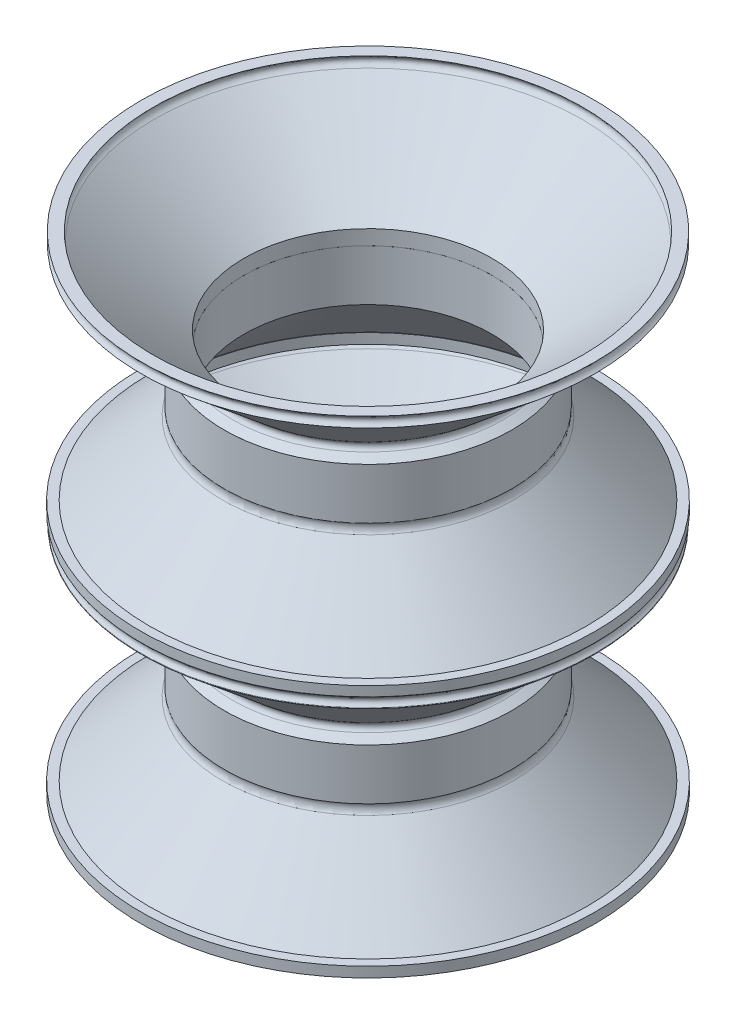
ISO-10303-21;
HEADER;
FILE_DESCRIPTION(('STEP AP214'),'2;1');
FILE_NAME('part.step','',(''),(''),'','','');
FILE_SCHEMA(('AUTOMOTIVE_DESIGN { 1 0 10303 214 1 1 1 1 }'));
ENDSEC;
DATA;
#1=APPLICATION_CONTEXT('core data for automotive mechanical design processes');
#2=APPLICATION_PROTOCOL_DEFINITION('international standard','automotive_design',2000,#1);
#3=PRODUCT_CONTEXT('',#1,'mechanical');
#4=PRODUCT('Part','Part','',(#3));
#5=PRODUCT_RELATED_PRODUCT_CATEGORY('part','',(#4));
#6=PRODUCT_DEFINITION_FORMATION('','',#4);
#7=PRODUCT_DEFINITION_CONTEXT('part definition',#1,'design');
#8=PRODUCT_DEFINITION('design','',#6,#7);
#9=PRODUCT_DEFINITION_SHAPE('','',#8);
#10=(LENGTH_UNIT() NAMED_UNIT(*) SI_UNIT(.MILLI.,.METRE.));
#11=(NAMED_UNIT(*) PLANE_ANGLE_UNIT() SI_UNIT($,.RADIAN.));
#12=(NAMED_UNIT(*) SI_UNIT($,.STERADIAN.) SOLID_ANGLE_UNIT());
#13=UNCERTAINTY_MEASURE_WITH_UNIT(LENGTH_MEASURE(1.E-05),#10,'distance_accuracy_value','');
#14=(GEOMETRIC_REPRESENTATION_CONTEXT(3) GLOBAL_UNCERTAINTY_ASSIGNED_CONTEXT((#13)) GLOBAL_UNIT_ASSIGNED_CONTEXT((#10,
#11,#12)) REPRESENTATION_CONTEXT('',''));
#15=CARTESIAN_POINT('',(0.,0.,0.));
#16=DIRECTION('',(0.,0.,1.));
#17=DIRECTION('',(1.,0.,0.));
#18=AXIS2_PLACEMENT_3D('',#15,#16,#17);
#19=CARTESIAN_POINT('',(12.266246150267,23.84,0.));
#20=DIRECTION('',(0.,-1.,0.));
#21=DIRECTION('',(1.,0.,0.));
#22=AXIS2_PLACEMENT_3D('',#19,#20,#21);
#23=CONICAL_SURFACE('',#22,12.7105503207346,1.02390555454664);
#24=CARTESIAN_POINT('',(12.266246150267,23.4777114557299,0.));
#25=DIRECTION('',(0.,-1.,0.));
#26=DIRECTION('',(1.,0.,0.));
#27=AXIS2_PLACEMENT_3D('',#24,#25,#26);
#28=CIRCLE('',#27,13.3056020683309);
#29=CARTESIAN_POINT('',(25.5718482185979,23.4777114557299,0.));
#30=VERTEX_POINT('',#29);
#31=EDGE_CURVE('E11',#30,#30,#28,.T.);
#32=ORIENTED_EDGE('',*,*,#31,.T.);
#33=EDGE_LOOP('',(#32));
#34=FACE_BOUND('',#33,.T.);
#35=CARTESIAN_POINT('',(12.266246150267,22.9918152658715,0.));
#36=DIRECTION('',(0.,1.,0.));
#37=DIRECTION('',(-1.,0.,0.));
#38=AXIS2_PLACEMENT_3D('',#35,#36,#37);
#39=CIRCLE('',#38,14.1036769219207);
#40=CARTESIAN_POINT('',(-1.83743077165368,22.9918152658715,0.));
#41=VERTEX_POINT('',#40);
#42=EDGE_CURVE('E77',#41,#41,#39,.T.);
#43=ORIENTED_EDGE('',*,*,#42,.T.);
#44=EDGE_LOOP('',(#43));
#45=FACE_BOUND('',#44,.T.);
#46=ADVANCED_FACE('F54',(#34,#45),#23,.T.);
#47=CARTESIAN_POINT('',(12.266246150267,31.84,0.));
#48=DIRECTION('',(0.,1.,0.));
#49=DIRECTION('',(-1.,0.,0.));
#50=AXIS2_PLACEMENT_3D('',#47,#48,#49);
#51=CONICAL_SURFACE('',#50,22.2445790614883,0.87266462599717);
#52=CARTESIAN_POINT('',(12.266246150267,24.2878064534284,0.));
#53=DIRECTION('',(0.,1.,0.));
#54=DIRECTION('',(-1.,0.,0.));
#55=AXIS2_PLACEMENT_3D('',#52,#53,#54);
#56=CIRCLE('',#55,13.2442252703947);
#57=CARTESIAN_POINT('',(-0.977979120127719,24.2878064534284,0.));
#58=VERTEX_POINT('',#57);
#59=EDGE_CURVE('E61',#58,#58,#56,.T.);
#60=ORIENTED_EDGE('',*,*,#59,.T.);
#61=EDGE_LOOP('',(#60));
#62=FACE_BOUND('',#61,.T.);
#63=CARTESIAN_POINT('',(12.266246150267,31.84,0.));
#64=DIRECTION('',(0.,1.,0.));
#65=DIRECTION('',(-1.,0.,0.));
#66=AXIS2_PLACEMENT_3D('',#63,#64,#65);
#67=CIRCLE('',#66,22.2445790614883);
#68=CARTESIAN_POINT('',(-9.97833291122136,31.84,0.));
#69=VERTEX_POINT('',#68);
#70=EDGE_CURVE('E65',#69,#69,#67,.T.);
#71=ORIENTED_EDGE('',*,*,#70,.F.);
#72=EDGE_LOOP('',(#71));
#73=FACE_BOUND('',#72,.T.);
#74=ADVANCED_FACE('F123',(#62,#73),#51,.T.);
#75=CARTESIAN_POINT('',(12.266246150267,24.4397502558786,0.));
#76=DIRECTION('',(0.,1.,0.));
#77=DIRECTION('',(-1.,0.,0.));
#78=AXIS2_PLACEMENT_3D('',#75,#76,#77);
#79=CONICAL_SURFACE('',#78,12.1807257813488,0.87266462599717);
#80=CARTESIAN_POINT('',(12.266246150267,31.84,0.));
#81=DIRECTION('',(0.,-1.,0.));
#82=DIRECTION('',(1.,0.,0.));
#83=AXIS2_PLACEMENT_3D('',#80,#81,#82);
#84=CIRCLE('',#83,21.);
#85=CARTESIAN_POINT('',(33.266246150267,31.84,0.));
#86=VERTEX_POINT('',#85);
#87=EDGE_CURVE('E86',#86,#86,#84,.T.);
#88=ORIENTED_EDGE('',*,*,#87,.F.);
#89=EDGE_LOOP('',(#88));
#90=FACE_BOUND('',#89,.T.);
#91=CARTESIAN_POINT('',(12.266246150267,24.4397502558786,0.));
#92=DIRECTION('',(0.,1.,0.));
#93=DIRECTION('',(-1.,0.,0.));
#94=AXIS2_PLACEMENT_3D('',#91,#92,#93);
#95=CIRCLE('',#94,12.1807257813488);
#96=CARTESIAN_POINT('',(0.0855203689181672,24.4397502558786,0.));
#97=VERTEX_POINT('',#96);
#98=EDGE_CURVE('E69',#97,#97,#95,.T.);
#99=ORIENTED_EDGE('',*,*,#98,.F.);
#100=EDGE_LOOP('',(#99));
#101=FACE_BOUND('',#100,.T.);
#102=ADVANCED_FACE('F119',(#90,#101),#79,.F.);
#103=CARTESIAN_POINT('',(12.266246150267,31.4490180328199,0.));
#104=DIRECTION('',(0.,1.,0.));
#105=DIRECTION('',(-1.,0.,0.));
#106=AXIS2_PLACEMENT_3D('',#103,#104,#105);
#107=CYLINDRICAL_SURFACE('',#106,12.1807257813488);
#108=ORIENTED_EDGE('',*,*,#98,.T.);
#109=EDGE_LOOP('',(#108));
#110=FACE_BOUND('',#109,.T.);
#111=CARTESIAN_POINT('',(12.266246150267,22.9918152658715,0.));
#112=DIRECTION('',(0.,1.,0.));
#113=DIRECTION('',(-1.,0.,0.));
#114=AXIS2_PLACEMENT_3D('',#111,#112,#113);
#115=CIRCLE('',#114,12.1807257813488);
#116=CARTESIAN_POINT('',(0.0855203689181672,22.9918152658715,0.));
#117=VERTEX_POINT('',#116);
#118=EDGE_CURVE('E74',#117,#117,#115,.T.);
#119=ORIENTED_EDGE('',*,*,#118,.F.);
#120=EDGE_LOOP('',(#119));
#121=FACE_BOUND('',#120,.T.);
#122=ADVANCED_FACE('F115',(#110,#121),#107,.F.);
#123=CARTESIAN_POINT('',(0.0855203689181681,22.9918152658715,0.));
#124=DIRECTION('',(0.,-1.,0.));
#125=DIRECTION('',(1.,0.,0.));
#126=AXIS2_PLACEMENT_3D('',#123,#124,#125);
#127=PLANE('',#126);
#128=ORIENTED_EDGE('',*,*,#118,.T.);
#129=EDGE_LOOP('',(#128));
#130=FACE_BOUND('',#129,.T.);
#131=ORIENTED_EDGE('',*,*,#42,.F.);
#132=EDGE_LOOP('',(#131));
#133=FACE_BOUND('',#132,.T.);
#134=ADVANCED_FACE('F112',(#130,#133),#127,.T.);
#135=CARTESIAN_POINT('',(12.266246150267,23.9047842318689,0.));
#136=DIRECTION('',(0.,1.,0.));
#137=DIRECTION('',(-1.,0.,0.));
#138=AXIS2_PLACEMENT_3D('',#135,#136,#137);
#139=TOROIDAL_SURFACE('',#138,13.565619075238,0.5);
#140=ORIENTED_EDGE('',*,*,#31,.F.);
#141=EDGE_LOOP('',(#140));
#142=FACE_BOUND('',#141,.T.);
#143=ORIENTED_EDGE('',*,*,#59,.F.);
#144=EDGE_LOOP('',(#143));
#145=FACE_BOUND('',#144,.T.);
#146=ADVANCED_FACE('F56',(#142,#145),#139,.F.);
#147=CARTESIAN_POINT('',(-8.73375384973302,31.84,0.));
#148=CARTESIAN_POINT('',(-9.41713424360817,32.2947580248928,0.));
#149=CARTESIAN_POINT('',(-8.79657882871846,32.84,0.));
#150=B_SPLINE_CURVE_WITH_KNOTS('',2,(#147,#148,#149),.UNSPECIFIED.,.F.,.F.,(3,3),(0.,1.),.UNSPECIFIED.);
#151=CARTESIAN_POINT('',(12.266246150267,3.87015566974782,0.));
#152=DIRECTION('',(0.,-1.,0.));
#153=AXIS1_PLACEMENT('',#151,#152);
#154=SURFACE_OF_REVOLUTION('',#150,#153);
#155=CARTESIAN_POINT('',(12.266246150267,32.84,0.));
#156=DIRECTION('',(0.,-1.,0.));
#157=DIRECTION('',(1.,0.,0.));
#158=AXIS2_PLACEMENT_3D('',#155,#156,#157);
#159=CIRCLE('',#158,21.0628249789854);
#160=CARTESIAN_POINT('',(33.3290711292524,32.84,0.));
#161=VERTEX_POINT('',#160);
#162=EDGE_CURVE('E80',#161,#161,#159,.T.);
#163=ORIENTED_EDGE('',*,*,#162,.F.);
#164=EDGE_LOOP('',(#163));
#165=FACE_BOUND('',#164,.T.);
#166=ORIENTED_EDGE('',*,*,#87,.T.);
#167=EDGE_LOOP('',(#166));
#168=FACE_BOUND('',#167,.T.);
#169=ADVANCED_FACE('F107',(#165,#168),#154,.T.);
#170=CARTESIAN_POINT('',(-8.79657882871846,32.84,0.));
#171=DIRECTION('',(0.,-1.,0.));
#172=DIRECTION('',(1.,0.,0.));
#173=AXIS2_PLACEMENT_3D('',#170,#171,#172);
#174=PLANE('',#173);
#175=CARTESIAN_POINT('',(12.266246150267,32.84,0.));
#176=DIRECTION('',(0.,-1.,0.));
#177=DIRECTION('',(1.,0.,0.));
#178=AXIS2_PLACEMENT_3D('',#175,#176,#177);
#179=CIRCLE('',#178,22.2445790614883);
#180=CARTESIAN_POINT('',(34.5108252117553,32.84,0.));
#181=VERTEX_POINT('',#180);
#182=EDGE_CURVE('E83',#181,#181,#179,.T.);
#183=ORIENTED_EDGE('',*,*,#182,.F.);
#184=EDGE_LOOP('',(#183));
#185=FACE_BOUND('',#184,.T.);
#186=ORIENTED_EDGE('',*,*,#162,.T.);
#187=EDGE_LOOP('',(#186));
#188=FACE_BOUND('',#187,.T.);
#189=ADVANCED_FACE('F103',(#185,#188),#174,.F.);
#190=CARTESIAN_POINT('',(-9.97833291122136,32.84,0.));
#191=CARTESIAN_POINT('',(-9.32229251414753,32.3233569168223,0.));
#192=CARTESIAN_POINT('',(-9.97833291122136,31.84,0.));
#193=B_SPLINE_CURVE_WITH_KNOTS('',2,(#190,#191,#192),.UNSPECIFIED.,.F.,.F.,(3,3),(0.,1.),.UNSPECIFIED.);
#194=CARTESIAN_POINT('',(12.266246150267,3.87015566974782,0.));
#195=DIRECTION('',(0.,-1.,0.));
#196=AXIS1_PLACEMENT('',#194,#195);
#197=SURFACE_OF_REVOLUTION('',#193,#196);
#198=ORIENTED_EDGE('',*,*,#70,.T.);
#199=EDGE_LOOP('',(#198));
#200=FACE_BOUND('',#199,.T.);
#201=ORIENTED_EDGE('',*,*,#182,.T.);
#202=EDGE_LOOP('',(#201));
#203=FACE_BOUND('',#202,.T.);
#204=ADVANCED_FACE('F100',(#200,#203),#197,.T.);
#205=CLOSED_SHELL('',(#46,#74,#102,#122,#134,#146,#169,#189,#204));
#206=MANIFOLD_SOLID_BREP('B2',#205);
#207=CARTESIAN_POINT('',(12.266246150267,22.9918152658715,0.));
#208=DIRECTION('',(0.,-1.,0.));
#209=DIRECTION('',(1.,0.,0.));
#210=AXIS2_PLACEMENT_3D('',#207,#208,#209);
#211=PLANE('',#210);
#212=CARTESIAN_POINT('',(12.266246150267,22.9918152658715,0.));
#213=DIRECTION('',(0.,-1.,0.));
#214=DIRECTION('',(1.,0.,0.));
#215=AXIS2_PLACEMENT_3D('',#212,#213,#214);
#216=CIRCLE('',#215,14.1036769219207);
#217=CARTESIAN_POINT('',(26.3699230721876,22.9918152658715,0.));
#218=VERTEX_POINT('',#217);
#219=EDGE_CURVE('E231',#218,#218,#216,.T.);
#220=ORIENTED_EDGE('',*,*,#219,.F.);
#221=EDGE_LOOP('',(#220));
#222=FACE_BOUND('',#221,.T.);
#223=CARTESIAN_POINT('',(12.266246150267,22.9918152658715,0.));
#224=DIRECTION('',(0.,-1.,0.));
#225=DIRECTION('',(1.,0.,0.));
#226=AXIS2_PLACEMENT_3D('',#223,#224,#225);
#227=CIRCLE('',#226,12.1807257813488);
#228=CARTESIAN_POINT('',(24.4469719316158,22.9918152658715,0.));
#229=VERTEX_POINT('',#228);
#230=EDGE_CURVE('E234',#229,#229,#227,.T.);
#231=ORIENTED_EDGE('',*,*,#230,.T.);
#232=EDGE_LOOP('',(#231));
#233=FACE_BOUND('',#232,.T.);
#234=ADVANCED_FACE('F213',(#222,#233),#211,.F.);
#235=CARTESIAN_POINT('',(12.266246150267,17.9918152658715,0.));
#236=DIRECTION('',(0.,1.,0.));
#237=DIRECTION('',(-1.,0.,0.));
#238=AXIS2_PLACEMENT_3D('',#235,#236,#237);
#239=CYLINDRICAL_SURFACE('',#238,14.1036769219207);
#240=CARTESIAN_POINT('',(12.266246150267,17.9918152658715,0.));
#241=DIRECTION('',(0.,-1.,0.));
#242=DIRECTION('',(1.,0.,0.));
#243=AXIS2_PLACEMENT_3D('',#240,#241,#242);
#244=CIRCLE('',#243,14.1036769219207);
#245=CARTESIAN_POINT('',(26.3699230721876,17.9918152658715,0.));
#246=VERTEX_POINT('',#245);
#247=EDGE_CURVE('E228',#246,#246,#244,.T.);
#248=ORIENTED_EDGE('',*,*,#247,.F.);
#249=EDGE_LOOP('',(#248));
#250=FACE_BOUND('',#249,.T.);
#251=ORIENTED_EDGE('',*,*,#219,.T.);
#252=EDGE_LOOP('',(#251));
#253=FACE_BOUND('',#252,.T.);
#254=ADVANCED_FACE('F279',(#250,#253),#239,.T.);
#255=CARTESIAN_POINT('',(12.266246150267,17.9918152658715,0.));
#256=DIRECTION('',(0.,1.,0.));
#257=DIRECTION('',(-1.,0.,0.));
#258=AXIS2_PLACEMENT_3D('',#255,#256,#257);
#259=CYLINDRICAL_SURFACE('',#258,12.1807257813488);
#260=CARTESIAN_POINT('',(12.266246150267,17.9918152658715,0.));
#261=DIRECTION('',(0.,-1.,0.));
#262=DIRECTION('',(1.,0.,0.));
#263=AXIS2_PLACEMENT_3D('',#260,#261,#262);
#264=CIRCLE('',#263,12.1807257813488);
#265=CARTESIAN_POINT('',(24.4469719316158,17.9918152658715,0.));
#266=VERTEX_POINT('',#265);
#267=EDGE_CURVE('E242',#266,#266,#264,.T.);
#268=ORIENTED_EDGE('',*,*,#267,.T.);
#269=EDGE_LOOP('',(#268));
#270=FACE_BOUND('',#269,.T.);
#271=ORIENTED_EDGE('',*,*,#230,.F.);
#272=EDGE_LOOP('',(#271));
#273=FACE_BOUND('',#272,.T.);
#274=ADVANCED_FACE('F285',(#270,#273),#259,.F.);
#275=CARTESIAN_POINT('',(12.266246150267,17.9918152658715,0.));
#276=DIRECTION('',(0.,-1.,0.));
#277=DIRECTION('',(1.,0.,0.));
#278=AXIS2_PLACEMENT_3D('',#275,#276,#277);
#279=CONICAL_SURFACE('',#278,13.4252337162371,0.785398163397447);
#280=CARTESIAN_POINT('',(12.266246150267,17.1342172194325,0.));
#281=DIRECTION('',(0.,1.,0.));
#282=DIRECTION('',(-1.,0.,0.));
#283=AXIS2_PLACEMENT_3D('',#280,#281,#282);
#284=CIRCLE('',#283,14.2828317626761);
#285=CARTESIAN_POINT('',(-2.01658561240912,17.1342172194325,0.));
#286=VERTEX_POINT('',#285);
#287=EDGE_CURVE('E224',#286,#286,#284,.F.);
#288=ORIENTED_EDGE('',*,*,#287,.T.);
#289=EDGE_LOOP('',(#288));
#290=FACE_BOUND('',#289,.T.);
#291=CARTESIAN_POINT('',(12.266246150267,9.99181526587148,0.));
#292=DIRECTION('',(0.,-1.,0.));
#293=DIRECTION('',(1.,0.,0.));
#294=AXIS2_PLACEMENT_3D('',#291,#292,#293);
#295=CIRCLE('',#294,21.4252337162371);
#296=CARTESIAN_POINT('',(33.6914798665041,9.99181526587149,0.));
#297=VERTEX_POINT('',#296);
#298=EDGE_CURVE('E239',#297,#297,#295,.T.);
#299=ORIENTED_EDGE('',*,*,#298,.F.);
#300=EDGE_LOOP('',(#299));
#301=FACE_BOUND('',#300,.T.);
#302=ADVANCED_FACE('F298',(#290,#301),#279,.T.);
#303=CARTESIAN_POINT('',(12.266246150267,9.99181526587148,0.));
#304=DIRECTION('',(0.,-1.,0.));
#305=DIRECTION('',(1.,0.,0.));
#306=AXIS2_PLACEMENT_3D('',#303,#304,#305);
#307=CONICAL_SURFACE('',#306,20.1807257813488,0.785398163397447);
#308=ORIENTED_EDGE('',*,*,#267,.F.);
#309=EDGE_LOOP('',(#308));
#310=FACE_BOUND('',#309,.T.);
#311=CARTESIAN_POINT('',(12.266246150267,9.99181526587148,0.));
#312=DIRECTION('',(0.,-1.,0.));
#313=DIRECTION('',(1.,0.,0.));
#314=AXIS2_PLACEMENT_3D('',#311,#312,#313);
#315=CIRCLE('',#314,20.1807257813488);
#316=CARTESIAN_POINT('',(32.4469719316158,9.99181526587148,0.));
#317=VERTEX_POINT('',#316);
#318=EDGE_CURVE('E243',#317,#317,#315,.T.);
#319=ORIENTED_EDGE('',*,*,#318,.T.);
#320=EDGE_LOOP('',(#319));
#321=FACE_BOUND('',#320,.T.);
#322=ADVANCED_FACE('F293',(#310,#321),#307,.F.);
#323=CARTESIAN_POINT('',(12.266246150267,17.6999026443817,0.));
#324=DIRECTION('',(0.,1.,0.));
#325=DIRECTION('',(-1.,0.,0.));
#326=AXIS2_PLACEMENT_3D('',#323,#324,#325);
#327=TOROIDAL_SURFACE('',#326,14.8485171876253,0.8);
#328=ORIENTED_EDGE('',*,*,#247,.T.);
#329=EDGE_LOOP('',(#328));
#330=FACE_BOUND('',#329,.T.);
#331=ORIENTED_EDGE('',*,*,#287,.F.);
#332=EDGE_LOOP('',(#331));
#333=FACE_BOUND('',#332,.T.);
#334=ADVANCED_FACE('F275',(#330,#333),#327,.F.);
#335=CARTESIAN_POINT('',(12.266246150267,9.99181526587148,0.));
#336=DIRECTION('',(0.,-1.,0.));
#337=DIRECTION('',(1.,0.,0.));
#338=AXIS2_PLACEMENT_3D('',#335,#336,#337);
#339=PLANE('',#338);
#340=CARTESIAN_POINT('',(12.266246150267,9.99181526587148,0.));
#341=DIRECTION('',(0.,-1.,0.));
#342=DIRECTION('',(1.,0.,0.));
#343=AXIS2_PLACEMENT_3D('',#340,#341,#342);
#344=CIRCLE('',#343,20.1307257813488);
#345=CARTESIAN_POINT('',(32.3969719316158,9.99181526587148,0.));
#346=VERTEX_POINT('',#345);
#347=EDGE_CURVE('E252',#346,#346,#344,.T.);
#348=ORIENTED_EDGE('',*,*,#347,.T.);
#349=EDGE_LOOP('',(#348));
#350=FACE_BOUND('',#349,.T.);
#351=ORIENTED_EDGE('',*,*,#318,.F.);
#352=EDGE_LOOP('',(#351));
#353=FACE_BOUND('',#352,.T.);
#354=ADVANCED_FACE('F264',(#350,#353),#339,.F.);
#355=CARTESIAN_POINT('',(12.266246150267,8.99181526587148,0.));
#356=DIRECTION('',(0.,-1.,0.));
#357=DIRECTION('',(1.,0.,0.));
#358=AXIS2_PLACEMENT_3D('',#355,#356,#357);
#359=PLANE('',#358);
#360=CARTESIAN_POINT('',(12.266246150267,8.99181526587148,0.));
#361=DIRECTION('',(0.,-1.,0.));
#362=DIRECTION('',(1.,0.,0.));
#363=AXIS2_PLACEMENT_3D('',#360,#361,#362);
#364=CIRCLE('',#363,22.2445790614883);
#365=CARTESIAN_POINT('',(34.5108252117553,8.99181526587149,0.));
#366=VERTEX_POINT('',#365);
#367=EDGE_CURVE('E220',#366,#366,#364,.T.);
#368=ORIENTED_EDGE('',*,*,#367,.T.);
#369=EDGE_LOOP('',(#368));
#370=FACE_BOUND('',#369,.T.);
#371=CARTESIAN_POINT('',(12.266246150267,8.99181526587148,0.));
#372=DIRECTION('',(0.,-1.,0.));
#373=DIRECTION('',(1.,0.,0.));
#374=AXIS2_PLACEMENT_3D('',#371,#372,#373);
#375=CIRCLE('',#374,20.1307257813488);
#376=CARTESIAN_POINT('',(32.3969719316158,8.99181526587148,0.));
#377=VERTEX_POINT('',#376);
#378=EDGE_CURVE('E251',#377,#377,#375,.T.);
#379=ORIENTED_EDGE('',*,*,#378,.F.);
#380=EDGE_LOOP('',(#379));
#381=FACE_BOUND('',#380,.T.);
#382=ADVANCED_FACE('F261',(#370,#381),#359,.T.);
#383=ORIENTED_EDGE('',*,*,#298,.T.);
#384=EDGE_LOOP('',(#383));
#385=FACE_BOUND('',#384,.T.);
#386=CARTESIAN_POINT('',(12.266246150267,9.99181526587148,0.));
#387=DIRECTION('',(0.,-1.,0.));
#388=DIRECTION('',(1.,0.,0.));
#389=AXIS2_PLACEMENT_3D('',#386,#387,#388);
#390=CIRCLE('',#389,22.2945790614883);
#391=CARTESIAN_POINT('',(34.5608252117553,9.99181526587149,0.));
#392=VERTEX_POINT('',#391);
#393=EDGE_CURVE('E246',#392,#392,#390,.T.);
#394=ORIENTED_EDGE('',*,*,#393,.F.);
#395=EDGE_LOOP('',(#394));
#396=FACE_BOUND('',#395,.T.);
#397=ADVANCED_FACE('F263',(#385,#396),#339,.F.);
#398=CARTESIAN_POINT('',(12.266246150267,8.99181526587148,0.));
#399=DIRECTION('',(0.,1.,0.));
#400=DIRECTION('',(-1.,0.,0.));
#401=AXIS2_PLACEMENT_3D('',#398,#399,#400);
#402=CYLINDRICAL_SURFACE('',#401,22.2945790614883);
#403=CARTESIAN_POINT('',(12.266246150267,9.04181526587148,0.));
#404=DIRECTION('',(0.,-1.,0.));
#405=DIRECTION('',(1.,0.,0.));
#406=AXIS2_PLACEMENT_3D('',#403,#404,#405);
#407=CIRCLE('',#406,22.2945790614883);
#408=CARTESIAN_POINT('',(34.5608252117553,9.04181526587148,0.));
#409=VERTEX_POINT('',#408);
#410=EDGE_CURVE('E53',#409,#409,#407,.F.);
#411=ORIENTED_EDGE('',*,*,#410,.T.);
#412=EDGE_LOOP('',(#411));
#413=FACE_BOUND('',#412,.T.);
#414=ORIENTED_EDGE('',*,*,#393,.T.);
#415=EDGE_LOOP('',(#414));
#416=FACE_BOUND('',#415,.T.);
#417=ADVANCED_FACE('F271',(#413,#416),#402,.T.);
#418=CARTESIAN_POINT('',(12.266246150267,8.99181526587148,0.));
#419=DIRECTION('',(0.,1.,0.));
#420=DIRECTION('',(-1.,0.,0.));
#421=AXIS2_PLACEMENT_3D('',#418,#419,#420);
#422=CYLINDRICAL_SURFACE('',#421,20.1307257813488);
#423=ORIENTED_EDGE('',*,*,#378,.T.);
#424=EDGE_LOOP('',(#423));
#425=FACE_BOUND('',#424,.T.);
#426=ORIENTED_EDGE('',*,*,#347,.F.);
#427=EDGE_LOOP('',(#426));
#428=FACE_BOUND('',#427,.T.);
#429=ADVANCED_FACE('F258',(#425,#428),#422,.F.);
#430=CARTESIAN_POINT('',(12.266246150267,9.04181526587148,0.));
#431=DIRECTION('',(0.,-1.,0.));
#432=DIRECTION('',(1.,0.,0.));
#433=AXIS2_PLACEMENT_3D('',#430,#431,#432);
#434=TOROIDAL_SURFACE('',#433,22.2445790614883,0.05);
#435=ORIENTED_EDGE('',*,*,#410,.F.);
#436=EDGE_LOOP('',(#435));
#437=FACE_BOUND('',#436,.T.);
#438=ORIENTED_EDGE('',*,*,#367,.F.);
#439=EDGE_LOOP('',(#438));
#440=FACE_BOUND('',#439,.T.);
#441=ADVANCED_FACE('F215',(#437,#440),#434,.T.);
#442=CLOSED_SHELL('',(#234,#254,#274,#302,#322,#334,#354,#382,#397,#417,#429,#441));
#443=MANIFOLD_SOLID_BREP('B6',#442);
#444=CARTESIAN_POINT('',(12.266246150267,-0.84818473412852,0.));
#445=DIRECTION('',(0.,-1.,0.));
#446=DIRECTION('',(1.,0.,0.));
#447=AXIS2_PLACEMENT_3D('',#444,#445,#446);
#448=PLANE('',#447);
#449=CARTESIAN_POINT('',(12.266246150267,-0.84818473412852,0.));
#450=DIRECTION('',(0.,-1.,0.));
#451=DIRECTION('',(1.,0.,0.));
#452=AXIS2_PLACEMENT_3D('',#449,#450,#451);
#453=CIRCLE('',#452,14.1036769219207);
#454=CARTESIAN_POINT('',(26.3699230721876,-0.848184734128518,0.));
#455=VERTEX_POINT('',#454);
#456=EDGE_CURVE('E414',#455,#455,#453,.T.);
#457=ORIENTED_EDGE('',*,*,#456,.F.);
#458=EDGE_LOOP('',(#457));
#459=FACE_BOUND('',#458,.T.);
#460=CARTESIAN_POINT('',(12.266246150267,-0.84818473412852,0.));
#461=DIRECTION('',(0.,-1.,0.));
#462=DIRECTION('',(1.,0.,0.));
#463=AXIS2_PLACEMENT_3D('',#460,#461,#462);
#464=CIRCLE('',#463,12.1807257813488);
#465=CARTESIAN_POINT('',(24.4469719316158,-0.848184734128518,0.));
#466=VERTEX_POINT('',#465);
#467=EDGE_CURVE('E420',#466,#466,#464,.T.);
#468=ORIENTED_EDGE('',*,*,#467,.T.);
#469=EDGE_LOOP('',(#468));
#470=FACE_BOUND('',#469,.T.);
#471=ADVANCED_FACE('F401',(#459,#470),#448,.F.);
#472=CARTESIAN_POINT('',(12.266246150267,-5.84818473412852,0.));
#473=DIRECTION('',(0.,1.,0.));
#474=DIRECTION('',(-1.,0.,0.));
#475=AXIS2_PLACEMENT_3D('',#472,#473,#474);
#476=CYLINDRICAL_SURFACE('',#475,14.1036769219207);
#477=CARTESIAN_POINT('',(12.266246150267,-5.84818473412852,0.));
#478=DIRECTION('',(0.,-1.,0.));
#479=DIRECTION('',(1.,0.,0.));
#480=AXIS2_PLACEMENT_3D('',#477,#478,#479);
#481=CIRCLE('',#480,14.1036769219207);
#482=CARTESIAN_POINT('',(26.3699230721876,-5.84818473412852,0.));
#483=VERTEX_POINT('',#482);
#484=EDGE_CURVE('E409',#483,#483,#481,.T.);
#485=ORIENTED_EDGE('',*,*,#484,.F.);
#486=EDGE_LOOP('',(#485));
#487=FACE_BOUND('',#486,.T.);
#488=ORIENTED_EDGE('',*,*,#456,.T.);
#489=EDGE_LOOP('',(#488));
#490=FACE_BOUND('',#489,.T.);
#491=ADVANCED_FACE('F473',(#487,#490),#476,.T.);
#492=CARTESIAN_POINT('',(12.266246150267,-5.84818473412852,0.));
#493=DIRECTION('',(0.,1.,0.));
#494=DIRECTION('',(-1.,0.,0.));
#495=AXIS2_PLACEMENT_3D('',#492,#493,#494);
#496=CYLINDRICAL_SURFACE('',#495,12.1807257813488);
#497=CARTESIAN_POINT('',(12.266246150267,-5.84818473412852,0.));
#498=DIRECTION('',(0.,-1.,0.));
#499=DIRECTION('',(1.,0.,0.));
#500=AXIS2_PLACEMENT_3D('',#497,#498,#499);
#501=CIRCLE('',#500,12.1807257813488);
#502=CARTESIAN_POINT('',(24.4469719316158,-5.84818473412852,0.));
#503=VERTEX_POINT('',#502);
#504=EDGE_CURVE('E429',#503,#503,#501,.T.);
#505=ORIENTED_EDGE('',*,*,#504,.T.);
#506=EDGE_LOOP('',(#505));
#507=FACE_BOUND('',#506,.T.);
#508=ORIENTED_EDGE('',*,*,#467,.F.);
#509=EDGE_LOOP('',(#508));
#510=FACE_BOUND('',#509,.T.);
#511=ADVANCED_FACE('F479',(#507,#510),#496,.F.);
#512=CARTESIAN_POINT('',(12.266246150267,-5.84818473412852,0.));
#513=DIRECTION('',(0.,-1.,0.));
#514=DIRECTION('',(1.,0.,0.));
#515=AXIS2_PLACEMENT_3D('',#512,#513,#514);
#516=CONICAL_SURFACE('',#515,13.4252337162371,0.785398163397447);
#517=CARTESIAN_POINT('',(12.266246150267,-6.70578278056749,0.));
#518=DIRECTION('',(0.,1.,0.));
#519=DIRECTION('',(-1.,0.,0.));
#520=AXIS2_PLACEMENT_3D('',#517,#518,#519);
#521=CIRCLE('',#520,14.2828317626761);
#522=CARTESIAN_POINT('',(-2.01658561240912,-6.70578278056749,0.));
#523=VERTEX_POINT('',#522);
#524=EDGE_CURVE('E212',#523,#523,#521,.F.);
#525=ORIENTED_EDGE('',*,*,#524,.T.);
#526=EDGE_LOOP('',(#525));
#527=FACE_BOUND('',#526,.T.);
#528=CARTESIAN_POINT('',(12.266246150267,-13.8481847341285,0.));
#529=DIRECTION('',(0.,-1.,0.));
#530=DIRECTION('',(1.,0.,0.));
#531=AXIS2_PLACEMENT_3D('',#528,#529,#530);
#532=CIRCLE('',#531,21.4252337162371);
#533=CARTESIAN_POINT('',(33.6914798665041,-13.8481847341285,0.));
#534=VERTEX_POINT('',#533);
#535=EDGE_CURVE('E425',#534,#534,#532,.T.);
#536=ORIENTED_EDGE('',*,*,#535,.F.);
#537=EDGE_LOOP('',(#536));
#538=FACE_BOUND('',#537,.T.);
#539=ADVANCED_FACE('F486',(#527,#538),#516,.T.);
#540=CARTESIAN_POINT('',(12.266246150267,-13.8481847341285,0.));
#541=DIRECTION('',(0.,-1.,0.));
#542=DIRECTION('',(1.,0.,0.));
#543=AXIS2_PLACEMENT_3D('',#540,#541,#542);
#544=CONICAL_SURFACE('',#543,20.1807257813488,0.785398163397447);
#545=ORIENTED_EDGE('',*,*,#504,.F.);
#546=EDGE_LOOP('',(#545));
#547=FACE_BOUND('',#546,.T.);
#548=CARTESIAN_POINT('',(12.266246150267,-13.8481847341285,0.));
#549=DIRECTION('',(0.,-1.,0.));
#550=DIRECTION('',(1.,0.,0.));
#551=AXIS2_PLACEMENT_3D('',#548,#549,#550);
#552=CIRCLE('',#551,20.1807257813488);
#553=CARTESIAN_POINT('',(32.4469719316158,-13.8481847341285,0.));
#554=VERTEX_POINT('',#553);
#555=EDGE_CURVE('E430',#554,#554,#552,.T.);
#556=ORIENTED_EDGE('',*,*,#555,.T.);
#557=EDGE_LOOP('',(#556));
#558=FACE_BOUND('',#557,.T.);
#559=ADVANCED_FACE('F490',(#547,#558),#544,.F.);
#560=CARTESIAN_POINT('',(12.266246150267,-6.14009735561825,0.));
#561=DIRECTION('',(0.,1.,0.));
#562=DIRECTION('',(-1.,0.,0.));
#563=AXIS2_PLACEMENT_3D('',#560,#561,#562);
#564=TOROIDAL_SURFACE('',#563,14.8485171876253,0.8);
#565=ORIENTED_EDGE('',*,*,#484,.T.);
#566=EDGE_LOOP('',(#565));
#567=FACE_BOUND('',#566,.T.);
#568=ORIENTED_EDGE('',*,*,#524,.F.);
#569=EDGE_LOOP('',(#568));
#570=FACE_BOUND('',#569,.T.);
#571=ADVANCED_FACE('F403',(#567,#570),#564,.F.);
#572=CARTESIAN_POINT('',(12.266246150267,-13.8481847341285,0.));
#573=DIRECTION('',(0.,-1.,0.));
#574=DIRECTION('',(1.,0.,0.));
#575=AXIS2_PLACEMENT_3D('',#572,#573,#574);
#576=PLANE('',#575);
#577=CARTESIAN_POINT('',(12.266246150267,-13.8481847341285,0.));
#578=DIRECTION('',(0.,-1.,0.));
#579=DIRECTION('',(1.,0.,0.));
#580=AXIS2_PLACEMENT_3D('',#577,#578,#579);
#581=CIRCLE('',#580,20.1307257813488);
#582=CARTESIAN_POINT('',(32.3969719316158,-13.8481847341285,0.));
#583=VERTEX_POINT('',#582);
#584=EDGE_CURVE('E446',#583,#583,#581,.T.);
#585=ORIENTED_EDGE('',*,*,#584,.T.);
#586=EDGE_LOOP('',(#585));
#587=FACE_BOUND('',#586,.T.);
#588=ORIENTED_EDGE('',*,*,#555,.F.);
#589=EDGE_LOOP('',(#588));
#590=FACE_BOUND('',#589,.T.);
#591=ADVANCED_FACE('F460',(#587,#590),#576,.F.);
#592=CARTESIAN_POINT('',(12.266246150267,-14.8481847341285,0.));
#593=DIRECTION('',(0.,-1.,0.));
#594=DIRECTION('',(1.,0.,0.));
#595=AXIS2_PLACEMENT_3D('',#592,#593,#594);
#596=PLANE('',#595);
#597=CARTESIAN_POINT('',(12.266246150267,-14.8481847341285,0.));
#598=DIRECTION('',(0.,-1.,0.));
#599=DIRECTION('',(1.,0.,0.));
#600=AXIS2_PLACEMENT_3D('',#597,#598,#599);
#601=CIRCLE('',#600,22.2945790614883);
#602=CARTESIAN_POINT('',(34.5608252117553,-14.8481847341285,0.));
#603=VERTEX_POINT('',#602);
#604=EDGE_CURVE('E434',#603,#603,#601,.T.);
#605=ORIENTED_EDGE('',*,*,#604,.T.);
#606=EDGE_LOOP('',(#605));
#607=FACE_BOUND('',#606,.T.);
#608=CARTESIAN_POINT('',(12.266246150267,-14.8481847341285,0.));
#609=DIRECTION('',(0.,-1.,0.));
#610=DIRECTION('',(1.,0.,0.));
#611=AXIS2_PLACEMENT_3D('',#608,#609,#610);
#612=CIRCLE('',#611,20.1307257813488);
#613=CARTESIAN_POINT('',(32.3969719316158,-14.8481847341285,0.));
#614=VERTEX_POINT('',#613);
#615=EDGE_CURVE('E442',#614,#614,#612,.T.);
#616=ORIENTED_EDGE('',*,*,#615,.F.);
#617=EDGE_LOOP('',(#616));
#618=FACE_BOUND('',#617,.T.);
#619=ADVANCED_FACE('F457',(#607,#618),#596,.T.);
#620=ORIENTED_EDGE('',*,*,#535,.T.);
#621=EDGE_LOOP('',(#620));
#622=FACE_BOUND('',#621,.T.);
#623=CARTESIAN_POINT('',(12.266246150267,-13.8481847341285,0.));
#624=DIRECTION('',(0.,-1.,0.));
#625=DIRECTION('',(1.,0.,0.));
#626=AXIS2_PLACEMENT_3D('',#623,#624,#625);
#627=CIRCLE('',#626,22.2945790614883);
#628=CARTESIAN_POINT('',(34.5608252117553,-13.8481847341285,0.));
#629=VERTEX_POINT('',#628);
#630=EDGE_CURVE('E438',#629,#629,#627,.T.);
#631=ORIENTED_EDGE('',*,*,#630,.F.);
#632=EDGE_LOOP('',(#631));
#633=FACE_BOUND('',#632,.T.);
#634=ADVANCED_FACE('F459',(#622,#633),#576,.F.);
#635=CARTESIAN_POINT('',(12.266246150267,-14.8481847341285,0.));
#636=DIRECTION('',(0.,1.,0.));
#637=DIRECTION('',(-1.,0.,0.));
#638=AXIS2_PLACEMENT_3D('',#635,#636,#637);
#639=CYLINDRICAL_SURFACE('',#638,22.2945790614883);
#640=ORIENTED_EDGE('',*,*,#604,.F.);
#641=EDGE_LOOP('',(#640));
#642=FACE_BOUND('',#641,.T.);
#643=ORIENTED_EDGE('',*,*,#630,.T.);
#644=EDGE_LOOP('',(#643));
#645=FACE_BOUND('',#644,.T.);
#646=ADVANCED_FACE('F467',(#642,#645),#639,.T.);
#647=CARTESIAN_POINT('',(12.266246150267,-14.8481847341285,0.));
#648=DIRECTION('',(0.,1.,0.));
#649=DIRECTION('',(-1.,0.,0.));
#650=AXIS2_PLACEMENT_3D('',#647,#648,#649);
#651=CYLINDRICAL_SURFACE('',#650,20.1307257813488);
#652=ORIENTED_EDGE('',*,*,#615,.T.);
#653=EDGE_LOOP('',(#652));
#654=FACE_BOUND('',#653,.T.);
#655=ORIENTED_EDGE('',*,*,#584,.F.);
#656=EDGE_LOOP('',(#655));
#657=FACE_BOUND('',#656,.T.);
#658=ADVANCED_FACE('F454',(#654,#657),#651,.F.);
#659=CLOSED_SHELL('',(#471,#491,#511,#539,#559,#571,#591,#619,#634,#646,#658));
#660=MANIFOLD_SOLID_BREP('B48',#659);
#661=CARTESIAN_POINT('',(12.266246150267,0.,0.));
#662=DIRECTION('',(0.,-1.,0.));
#663=DIRECTION('',(1.,0.,0.));
#664=AXIS2_PLACEMENT_3D('',#661,#662,#663);
#665=CONICAL_SURFACE('',#664,12.7105503207346,1.02390555454664);
#666=CARTESIAN_POINT('',(12.266246150267,-0.362288544270145,0.));
#667=DIRECTION('',(0.,-1.,0.));
#668=DIRECTION('',(1.,0.,0.));
#669=AXIS2_PLACEMENT_3D('',#666,#667,#668);
#670=CIRCLE('',#669,13.3056020683309);
#671=CARTESIAN_POINT('',(25.5718482185979,-0.362288544270144,0.));
#672=VERTEX_POINT('',#671);
#673=EDGE_CURVE('E589',#672,#672,#670,.T.);
#674=ORIENTED_EDGE('',*,*,#673,.T.);
#675=EDGE_LOOP('',(#674));
#676=FACE_BOUND('',#675,.T.);
#677=CARTESIAN_POINT('',(12.266246150267,-0.848184734128519,0.));
#678=DIRECTION('',(0.,1.,0.));
#679=DIRECTION('',(-1.,0.,0.));
#680=AXIS2_PLACEMENT_3D('',#677,#678,#679);
#681=CIRCLE('',#680,14.1036769219207);
#682=CARTESIAN_POINT('',(-1.83743077165368,-0.848184734128521,0.));
#683=VERTEX_POINT('',#682);
#684=EDGE_CURVE('E604',#683,#683,#681,.T.);
#685=ORIENTED_EDGE('',*,*,#684,.T.);
#686=EDGE_LOOP('',(#685));
#687=FACE_BOUND('',#686,.T.);
#688=ADVANCED_FACE('F578',(#676,#687),#665,.T.);
#689=CARTESIAN_POINT('',(12.266246150267,8.,0.));
#690=DIRECTION('',(0.,1.,0.));
#691=DIRECTION('',(-1.,0.,0.));
#692=AXIS2_PLACEMENT_3D('',#689,#690,#691);
#693=CONICAL_SURFACE('',#692,22.2445790614883,0.87266462599717);
#694=CARTESIAN_POINT('',(12.266246150267,7.95996199984405,0.));
#695=DIRECTION('',(0.,1.,0.));
#696=DIRECTION('',(-1.,0.,0.));
#697=AXIS2_PLACEMENT_3D('',#694,#695,#696);
#698=CIRCLE('',#697,22.1968636309622);
#699=CARTESIAN_POINT('',(-9.93061748069522,7.95996199984405,0.));
#700=VERTEX_POINT('',#699);
#701=EDGE_CURVE('E400',#700,#700,#698,.F.);
#702=ORIENTED_EDGE('',*,*,#701,.T.);
#703=EDGE_LOOP('',(#702));
#704=FACE_BOUND('',#703,.T.);
#705=CARTESIAN_POINT('',(12.266246150267,0.44780645342838,0.));
#706=DIRECTION('',(0.,1.,0.));
#707=DIRECTION('',(-1.,0.,0.));
#708=AXIS2_PLACEMENT_3D('',#705,#706,#707);
#709=CIRCLE('',#708,13.2442252703947);
#710=CARTESIAN_POINT('',(-0.977979120127719,0.447806453428379,0.));
#711=VERTEX_POINT('',#710);
#712=EDGE_CURVE('E593',#711,#711,#709,.T.);
#713=ORIENTED_EDGE('',*,*,#712,.T.);
#714=EDGE_LOOP('',(#713));
#715=FACE_BOUND('',#714,.T.);
#716=ADVANCED_FACE('F650',(#704,#715),#693,.T.);
#717=CARTESIAN_POINT('',(12.266246150267,0.599750255878579,0.));
#718=DIRECTION('',(0.,1.,0.));
#719=DIRECTION('',(-1.,0.,0.));
#720=AXIS2_PLACEMENT_3D('',#717,#718,#719);
#721=CONICAL_SURFACE('',#720,12.1807257813488,0.87266462599717);
#722=CARTESIAN_POINT('',(12.266246150267,8.,0.));
#723=DIRECTION('',(0.,-1.,0.));
#724=DIRECTION('',(1.,0.,0.));
#725=AXIS2_PLACEMENT_3D('',#722,#723,#724);
#726=CIRCLE('',#725,21.);
#727=CARTESIAN_POINT('',(33.266246150267,8.00000000000001,0.));
#728=VERTEX_POINT('',#727);
#729=EDGE_CURVE('E613',#728,#728,#726,.T.);
#730=ORIENTED_EDGE('',*,*,#729,.F.);
#731=EDGE_LOOP('',(#730));
#732=FACE_BOUND('',#731,.T.);
#733=CARTESIAN_POINT('',(12.266246150267,0.599750255878579,0.));
#734=DIRECTION('',(0.,1.,0.));
#735=DIRECTION('',(-1.,0.,0.));
#736=AXIS2_PLACEMENT_3D('',#733,#734,#735);
#737=CIRCLE('',#736,12.1807257813488);
#738=CARTESIAN_POINT('',(0.0855203689181672,0.599750255878578,0.));
#739=VERTEX_POINT('',#738);
#740=EDGE_CURVE('E598',#739,#739,#737,.T.);
#741=ORIENTED_EDGE('',*,*,#740,.F.);
#742=EDGE_LOOP('',(#741));
#743=FACE_BOUND('',#742,.T.);
#744=ADVANCED_FACE('F646',(#732,#743),#721,.F.);
#745=CARTESIAN_POINT('',(12.266246150267,7.60901803281994,0.));
#746=DIRECTION('',(0.,1.,0.));
#747=DIRECTION('',(-1.,0.,0.));
#748=AXIS2_PLACEMENT_3D('',#745,#746,#747);
#749=CYLINDRICAL_SURFACE('',#748,12.1807257813488);
#750=ORIENTED_EDGE('',*,*,#740,.T.);
#751=EDGE_LOOP('',(#750));
#752=FACE_BOUND('',#751,.T.);
#753=CARTESIAN_POINT('',(12.266246150267,-0.848184734128519,0.));
#754=DIRECTION('',(0.,1.,0.));
#755=DIRECTION('',(-1.,0.,0.));
#756=AXIS2_PLACEMENT_3D('',#753,#754,#755);
#757=CIRCLE('',#756,12.1807257813488);
#758=CARTESIAN_POINT('',(0.0855203689181672,-0.848184734128521,0.));
#759=VERTEX_POINT('',#758);
#760=EDGE_CURVE('E601',#759,#759,#757,.T.);
#761=ORIENTED_EDGE('',*,*,#760,.F.);
#762=EDGE_LOOP('',(#761));
#763=FACE_BOUND('',#762,.T.);
#764=ADVANCED_FACE('F642',(#752,#763),#749,.F.);
#765=CARTESIAN_POINT('',(0.0855203689181681,-0.848184734128521,0.));
#766=DIRECTION('',(0.,-1.,0.));
#767=DIRECTION('',(1.,0.,0.));
#768=AXIS2_PLACEMENT_3D('',#765,#766,#767);
#769=PLANE('',#768);
#770=ORIENTED_EDGE('',*,*,#760,.T.);
#771=EDGE_LOOP('',(#770));
#772=FACE_BOUND('',#771,.T.);
#773=ORIENTED_EDGE('',*,*,#684,.F.);
#774=EDGE_LOOP('',(#773));
#775=FACE_BOUND('',#774,.T.);
#776=ADVANCED_FACE('F639',(#772,#775),#769,.T.);
#777=CARTESIAN_POINT('',(12.266246150267,0.0647842318688887,0.));
#778=DIRECTION('',(0.,1.,0.));
#779=DIRECTION('',(-1.,0.,0.));
#780=AXIS2_PLACEMENT_3D('',#777,#778,#779);
#781=TOROIDAL_SURFACE('',#780,13.565619075238,0.5);
#782=ORIENTED_EDGE('',*,*,#673,.F.);
#783=EDGE_LOOP('',(#782));
#784=FACE_BOUND('',#783,.T.);
#785=ORIENTED_EDGE('',*,*,#712,.F.);
#786=EDGE_LOOP('',(#785));
#787=FACE_BOUND('',#786,.T.);
#788=ADVANCED_FACE('F637',(#784,#787),#781,.F.);
#789=CARTESIAN_POINT('',(-8.73375384973302,8.,0.));
#790=CARTESIAN_POINT('',(-9.41713424360817,8.45475802489276,0.));
#791=CARTESIAN_POINT('',(-8.79657882871846,9.,0.));
#792=B_SPLINE_CURVE_WITH_KNOTS('',2,(#789,#790,#791),.UNSPECIFIED.,.F.,.F.,(3,3),(0.,1.),.UNSPECIFIED.);
#793=CARTESIAN_POINT('',(12.266246150267,-19.9698443302522,0.));
#794=DIRECTION('',(0.,-1.,0.));
#795=AXIS1_PLACEMENT('',#793,#794);
#796=SURFACE_OF_REVOLUTION('',#792,#795);
#797=CARTESIAN_POINT('',(12.266246150267,9.00000000000001,0.));
#798=DIRECTION('',(0.,-1.,0.));
#799=DIRECTION('',(1.,0.,0.));
#800=AXIS2_PLACEMENT_3D('',#797,#798,#799);
#801=CIRCLE('',#800,21.0628249789854);
#802=CARTESIAN_POINT('',(33.3290711292524,9.00000000000001,0.));
#803=VERTEX_POINT('',#802);
#804=EDGE_CURVE('E607',#803,#803,#801,.T.);
#805=ORIENTED_EDGE('',*,*,#804,.F.);
#806=EDGE_LOOP('',(#805));
#807=FACE_BOUND('',#806,.T.);
#808=ORIENTED_EDGE('',*,*,#729,.T.);
#809=EDGE_LOOP('',(#808));
#810=FACE_BOUND('',#809,.T.);
#811=ADVANCED_FACE('F633',(#807,#810),#796,.T.);
#812=CARTESIAN_POINT('',(-8.79657882871846,9.,0.));
#813=DIRECTION('',(0.,-1.,0.));
#814=DIRECTION('',(1.,0.,0.));
#815=AXIS2_PLACEMENT_3D('',#812,#813,#814);
#816=PLANE('',#815);
#817=CARTESIAN_POINT('',(12.266246150267,9.00000000000001,0.));
#818=DIRECTION('',(0.,-1.,0.));
#819=DIRECTION('',(1.,0.,0.));
#820=AXIS2_PLACEMENT_3D('',#817,#818,#819);
#821=CIRCLE('',#820,22.2445790614883);
#822=CARTESIAN_POINT('',(34.5108252117553,9.00000000000001,0.));
#823=VERTEX_POINT('',#822);
#824=EDGE_CURVE('E610',#823,#823,#821,.T.);
#825=ORIENTED_EDGE('',*,*,#824,.F.);
#826=EDGE_LOOP('',(#825));
#827=FACE_BOUND('',#826,.T.);
#828=ORIENTED_EDGE('',*,*,#804,.T.);
#829=EDGE_LOOP('',(#828));
#830=FACE_BOUND('',#829,.T.);
#831=ADVANCED_FACE('F630',(#827,#830),#816,.F.);
#832=CARTESIAN_POINT('',(-9.97833291122136,9.,0.));
#833=CARTESIAN_POINT('',(-9.32229251414753,8.4833569168223,0.));
#834=CARTESIAN_POINT('',(-9.97833291122136,8.,0.));
#835=B_SPLINE_CURVE_WITH_KNOTS('',2,(#832,#833,#834),.UNSPECIFIED.,.F.,.F.,(3,3),(0.,1.),.UNSPECIFIED.);
#836=CARTESIAN_POINT('',(12.266246150267,-19.9698443302522,0.));
#837=DIRECTION('',(0.,-1.,0.));
#838=AXIS1_PLACEMENT('',#836,#837);
#839=SURFACE_OF_REVOLUTION('',#835,#838);
#840=CARTESIAN_POINT('',(12.266246150267,8.03729967949807,0.));
#841=DIRECTION('',(0.,-1.,0.));
#842=DIRECTION('',(1.,0.,0.));
#843=AXIS2_PLACEMENT_3D('',#840,#841,#842);
#844=CIRCLE('',#843,22.1959689789599);
#845=CARTESIAN_POINT('',(34.4622151292269,8.03729967949807,0.));
#846=VERTEX_POINT('',#845);
#847=EDGE_CURVE('E585',#846,#846,#844,.F.);
#848=ORIENTED_EDGE('',*,*,#847,.T.);
#849=EDGE_LOOP('',(#848));
#850=FACE_BOUND('',#849,.T.);
#851=ORIENTED_EDGE('',*,*,#824,.T.);
#852=EDGE_LOOP('',(#851));
#853=FACE_BOUND('',#852,.T.);
#854=ADVANCED_FACE('F627',(#850,#853),#839,.T.);
#855=CARTESIAN_POINT('',(12.266246150267,7.998264222,0.));
#856=DIRECTION('',(0.,-1.,0.));
#857=DIRECTION('',(1.,0.,0.));
#858=AXIS2_PLACEMENT_3D('',#855,#856,#857);
#859=TOROIDAL_SURFACE('',#858,22.1647242504779,0.05);
#860=ORIENTED_EDGE('',*,*,#701,.F.);
#861=EDGE_LOOP('',(#860));
#862=FACE_BOUND('',#861,.T.);
#863=ORIENTED_EDGE('',*,*,#847,.F.);
#864=EDGE_LOOP('',(#863));
#865=FACE_BOUND('',#864,.T.);
#866=ADVANCED_FACE('F580',(#862,#865),#859,.T.);
#867=CLOSED_SHELL('',(#688,#716,#744,#764,#776,#788,#811,#831,#854,#866));
#868=MANIFOLD_SOLID_BREP('B207',#867);
#869=ADVANCED_BREP_SHAPE_REPRESENTATION('',(#18,#206,#443,#660,#868),#14);
#870=SHAPE_DEFINITION_REPRESENTATION(#9,#869);
ENDSEC;
END-ISO-10303-21;
